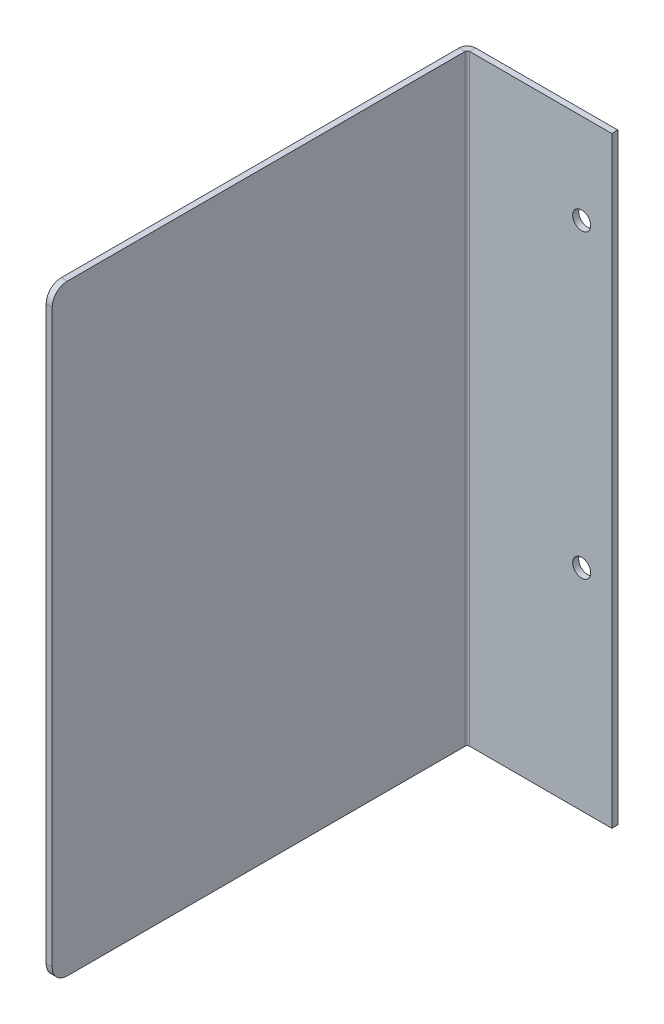
ISO-10303-21;
HEADER;
FILE_DESCRIPTION(('STEP AP214'),'2;1');
FILE_NAME('part.step','',(''),(''),'','','');
FILE_SCHEMA(('AUTOMOTIVE_DESIGN { 1 0 10303 214 1 1 1 1 }'));
ENDSEC;
DATA;
#1=APPLICATION_CONTEXT('core data for automotive mechanical design processes');
#2=APPLICATION_PROTOCOL_DEFINITION('international standard','automotive_design',2000,#1);
#3=PRODUCT_CONTEXT('',#1,'mechanical');
#4=PRODUCT('Part','Part','',(#3));
#5=PRODUCT_RELATED_PRODUCT_CATEGORY('part','',(#4));
#6=PRODUCT_DEFINITION_FORMATION('','',#4);
#7=PRODUCT_DEFINITION_CONTEXT('part definition',#1,'design');
#8=PRODUCT_DEFINITION('design','',#6,#7);
#9=PRODUCT_DEFINITION_SHAPE('','',#8);
#10=(LENGTH_UNIT() NAMED_UNIT(*) SI_UNIT(.MILLI.,.METRE.));
#11=(NAMED_UNIT(*) PLANE_ANGLE_UNIT() SI_UNIT($,.RADIAN.));
#12=(NAMED_UNIT(*) SI_UNIT($,.STERADIAN.) SOLID_ANGLE_UNIT());
#13=UNCERTAINTY_MEASURE_WITH_UNIT(LENGTH_MEASURE(1.E-05),#10,'distance_accuracy_value','');
#14=(GEOMETRIC_REPRESENTATION_CONTEXT(3) GLOBAL_UNCERTAINTY_ASSIGNED_CONTEXT((#13)) GLOBAL_UNIT_ASSIGNED_CONTEXT((#10,
#11,#12)) REPRESENTATION_CONTEXT('',''));
#15=CARTESIAN_POINT('',(0.,0.,0.));
#16=DIRECTION('',(0.,0.,1.));
#17=DIRECTION('',(1.,0.,0.));
#18=AXIS2_PLACEMENT_3D('',#15,#16,#17);
#19=CARTESIAN_POINT('',(-8.33759590792837,-192.250639386189,-2.));
#20=DIRECTION('',(0.,-1.,0.));
#21=DIRECTION('',(0.,0.,-1.));
#22=AXIS2_PLACEMENT_3D('',#19,#20,#21);
#23=PLANE('',#22);
#24=DIRECTION('',(1.,0.,0.));
#25=VECTOR('',#24,1.);
#26=CARTESIAN_POINT('',(-8.33759590792837,-192.250639386189,0.));
#27=LINE('',#26,#25);
#28=CARTESIAN_POINT('',(-5.60099590792837,-192.250639386189,0.));
#29=VERTEX_POINT('',#28);
#30=CARTESIAN_POINT('',(41.6624040920716,-192.250639386189,0.));
#31=VERTEX_POINT('',#30);
#32=EDGE_CURVE('E194',#29,#31,#27,.T.);
#33=ORIENTED_EDGE('',*,*,#32,.F.);
#34=DIRECTION('',(0.,0.,-1.));
#35=VECTOR('',#34,1.);
#36=CARTESIAN_POINT('',(-5.60099590792837,-192.250639386189,0.));
#37=LINE('',#36,#35);
#38=CARTESIAN_POINT('',(-5.60099590792834,-192.250639386189,-2.00000000000001));
#39=VERTEX_POINT('',#38);
#40=EDGE_CURVE('E183',#29,#39,#37,.T.);
#41=ORIENTED_EDGE('',*,*,#40,.T.);
#42=DIRECTION('',(1.,0.,0.));
#43=VECTOR('',#42,1.);
#44=CARTESIAN_POINT('',(-8.33759590792837,-192.250639386189,-2.));
#45=LINE('',#44,#43);
#46=CARTESIAN_POINT('',(41.6624040920716,-192.250639386189,-2.));
#47=VERTEX_POINT('',#46);
#48=EDGE_CURVE('E197',#39,#47,#45,.T.);
#49=ORIENTED_EDGE('',*,*,#48,.T.);
#50=DIRECTION('',(0.,0.,1.));
#51=VECTOR('',#50,1.);
#52=CARTESIAN_POINT('',(41.6624040920716,-192.250639386189,-2.));
#53=LINE('',#52,#51);
#54=EDGE_CURVE('E206',#47,#31,#53,.T.);
#55=ORIENTED_EDGE('',*,*,#54,.T.);
#56=EDGE_LOOP('',(#33,#41,#49,#55));
#57=FACE_BOUND('',#56,.T.);
#58=ADVANCED_FACE('F59',(#57),#23,.T.);
#59=CARTESIAN_POINT('',(0.,0.,-2.));
#60=DIRECTION('',(0.,0.,1.));
#61=DIRECTION('',(1.,0.,0.));
#62=AXIS2_PLACEMENT_3D('',#59,#60,#61);
#63=PLANE('',#62);
#64=CARTESIAN_POINT('',(31.6624040920716,-122.250639386189,-2.));
#65=DIRECTION('',(0.,0.,1.));
#66=DIRECTION('',(1.,0.,0.));
#67=AXIS2_PLACEMENT_3D('',#64,#65,#66);
#68=CIRCLE('',#67,3.);
#69=CARTESIAN_POINT('',(34.6624040920716,-122.250639386189,-2.));
#70=VERTEX_POINT('',#69);
#71=EDGE_CURVE('E253',#70,#70,#68,.T.);
#72=ORIENTED_EDGE('',*,*,#71,.T.);
#73=EDGE_LOOP('',(#72));
#74=FACE_BOUND('',#73,.T.);
#75=CARTESIAN_POINT('',(31.6624040920716,-22.2506393861893,-2.));
#76=DIRECTION('',(0.,0.,1.));
#77=DIRECTION('',(1.,0.,0.));
#78=AXIS2_PLACEMENT_3D('',#75,#76,#77);
#79=CIRCLE('',#78,3.);
#80=CARTESIAN_POINT('',(34.6624040920716,-22.2506393861893,-2.));
#81=VERTEX_POINT('',#80);
#82=EDGE_CURVE('E180',#81,#81,#79,.T.);
#83=ORIENTED_EDGE('',*,*,#82,.T.);
#84=EDGE_LOOP('',(#83));
#85=FACE_BOUND('',#84,.T.);
#86=DIRECTION('',(0.,-1.,0.));
#87=VECTOR('',#86,1.);
#88=CARTESIAN_POINT('',(-5.60099590792834,-192.250639386189,-2.00000000000001));
#89=LINE('',#88,#87);
#90=CARTESIAN_POINT('',(-5.60099590792837,7.74936061381075,-2.));
#91=VERTEX_POINT('',#90);
#92=EDGE_CURVE('E144',#39,#91,#89,.F.);
#93=ORIENTED_EDGE('',*,*,#92,.T.);
#94=DIRECTION('',(-1.,0.,0.));
#95=VECTOR('',#94,1.);
#96=CARTESIAN_POINT('',(-8.33759590792839,7.74936061381074,-2.));
#97=LINE('',#96,#95);
#98=CARTESIAN_POINT('',(41.6624040920716,7.74936061381074,-2.));
#99=VERTEX_POINT('',#98);
#100=EDGE_CURVE('E203',#99,#91,#97,.T.);
#101=ORIENTED_EDGE('',*,*,#100,.F.);
#102=DIRECTION('',(0.,1.,0.));
#103=VECTOR('',#102,1.);
#104=CARTESIAN_POINT('',(41.6624040920716,7.74936061381074,-2.));
#105=LINE('',#104,#103);
#106=EDGE_CURVE('E199',#47,#99,#105,.T.);
#107=ORIENTED_EDGE('',*,*,#106,.F.);
#108=ORIENTED_EDGE('',*,*,#48,.F.);
#109=EDGE_LOOP('',(#93,#101,#107,#108));
#110=FACE_BOUND('',#109,.T.);
#111=ADVANCED_FACE('F267',(#74,#85,#110),#63,.F.);
#112=CARTESIAN_POINT('',(0.,0.,0.));
#113=DIRECTION('',(0.,0.,1.));
#114=DIRECTION('',(1.,0.,0.));
#115=AXIS2_PLACEMENT_3D('',#112,#113,#114);
#116=PLANE('',#115);
#117=CARTESIAN_POINT('',(31.6624040920716,-122.250639386189,0.));
#118=DIRECTION('',(0.,0.,1.));
#119=DIRECTION('',(1.,0.,0.));
#120=AXIS2_PLACEMENT_3D('',#117,#118,#119);
#121=CIRCLE('',#120,3.);
#122=CARTESIAN_POINT('',(34.6624040920716,-122.250639386189,0.));
#123=VERTEX_POINT('',#122);
#124=EDGE_CURVE('E256',#123,#123,#121,.T.);
#125=ORIENTED_EDGE('',*,*,#124,.F.);
#126=EDGE_LOOP('',(#125));
#127=FACE_BOUND('',#126,.T.);
#128=CARTESIAN_POINT('',(31.6624040920716,-22.2506393861893,0.));
#129=DIRECTION('',(0.,0.,1.));
#130=DIRECTION('',(1.,0.,0.));
#131=AXIS2_PLACEMENT_3D('',#128,#129,#130);
#132=CIRCLE('',#131,3.);
#133=CARTESIAN_POINT('',(34.6624040920716,-22.2506393861893,0.));
#134=VERTEX_POINT('',#133);
#135=EDGE_CURVE('E250',#134,#134,#132,.T.);
#136=ORIENTED_EDGE('',*,*,#135,.F.);
#137=EDGE_LOOP('',(#136));
#138=FACE_BOUND('',#137,.T.);
#139=DIRECTION('',(-1.,0.,0.));
#140=VECTOR('',#139,1.);
#141=CARTESIAN_POINT('',(-8.33759590792839,7.74936061381074,0.));
#142=LINE('',#141,#140);
#143=CARTESIAN_POINT('',(41.6624040920716,7.74936061381074,0.));
#144=VERTEX_POINT('',#143);
#145=CARTESIAN_POINT('',(-5.60099590792837,7.74936061381073,0.));
#146=VERTEX_POINT('',#145);
#147=EDGE_CURVE('E200',#144,#146,#142,.T.);
#148=ORIENTED_EDGE('',*,*,#147,.T.);
#149=DIRECTION('',(0.,-1.,0.));
#150=VECTOR('',#149,1.);
#151=CARTESIAN_POINT('',(-5.60099590792837,-192.250639386189,0.));
#152=LINE('',#151,#150);
#153=EDGE_CURVE('E187',#29,#146,#152,.F.);
#154=ORIENTED_EDGE('',*,*,#153,.F.);
#155=ORIENTED_EDGE('',*,*,#32,.T.);
#156=DIRECTION('',(0.,1.,0.));
#157=VECTOR('',#156,1.);
#158=CARTESIAN_POINT('',(41.6624040920716,7.74936061381074,0.));
#159=LINE('',#158,#157);
#160=EDGE_CURVE('E208',#31,#144,#159,.T.);
#161=ORIENTED_EDGE('',*,*,#160,.T.);
#162=EDGE_LOOP('',(#148,#154,#155,#161));
#163=FACE_BOUND('',#162,.T.);
#164=ADVANCED_FACE('F263',(#127,#138,#163),#116,.T.);
#165=CARTESIAN_POINT('',(-8.33759590792839,7.74936061381074,-2.));
#166=DIRECTION('',(0.,1.,0.));
#167=DIRECTION('',(0.,0.,1.));
#168=AXIS2_PLACEMENT_3D('',#165,#166,#167);
#169=PLANE('',#168);
#170=DIRECTION('',(0.,0.,-1.));
#171=VECTOR('',#170,1.);
#172=CARTESIAN_POINT('',(-5.60099590792837,7.74936061381073,0.));
#173=LINE('',#172,#171);
#174=EDGE_CURVE('E191',#146,#91,#173,.T.);
#175=ORIENTED_EDGE('',*,*,#174,.F.);
#176=ORIENTED_EDGE('',*,*,#147,.F.);
#177=DIRECTION('',(0.,0.,1.));
#178=VECTOR('',#177,1.);
#179=CARTESIAN_POINT('',(41.6624040920716,7.74936061381074,-2.));
#180=LINE('',#179,#178);
#181=EDGE_CURVE('E213',#99,#144,#180,.T.);
#182=ORIENTED_EDGE('',*,*,#181,.F.);
#183=ORIENTED_EDGE('',*,*,#100,.T.);
#184=EDGE_LOOP('',(#175,#176,#182,#183));
#185=FACE_BOUND('',#184,.T.);
#186=ADVANCED_FACE('F266',(#185),#169,.T.);
#187=CARTESIAN_POINT('',(41.6624040920716,7.74936061381074,-2.));
#188=DIRECTION('',(1.,0.,0.));
#189=DIRECTION('',(0.,1.,0.));
#190=AXIS2_PLACEMENT_3D('',#187,#188,#189);
#191=PLANE('',#190);
#192=ORIENTED_EDGE('',*,*,#160,.F.);
#193=ORIENTED_EDGE('',*,*,#54,.F.);
#194=ORIENTED_EDGE('',*,*,#106,.T.);
#195=ORIENTED_EDGE('',*,*,#181,.T.);
#196=EDGE_LOOP('',(#192,#193,#194,#195));
#197=FACE_BOUND('',#196,.T.);
#198=ADVANCED_FACE('F286',(#197),#191,.T.);
#199=CARTESIAN_POINT('',(-5.60099590792838,7.74936061381073,0.736600000000001));
#200=DIRECTION('',(0.,1.,0.));
#201=DIRECTION('',(0.,0.,1.));
#202=AXIS2_PLACEMENT_3D('',#199,#200,#201);
#203=PLANE('',#202);
#204=DIRECTION('',(1.,0.,0.));
#205=VECTOR('',#204,1.);
#206=CARTESIAN_POINT('',(-8.33759590792839,7.74936061381074,0.736599999999989));
#207=LINE('',#206,#205);
#208=CARTESIAN_POINT('',(-6.33759590792839,7.74936061381073,0.736599999999999));
#209=VERTEX_POINT('',#208);
#210=CARTESIAN_POINT('',(-8.33759590792839,7.74936061381073,0.736599999999992));
#211=VERTEX_POINT('',#210);
#212=EDGE_CURVE('E177',#209,#211,#207,.F.);
#213=ORIENTED_EDGE('',*,*,#212,.F.);
#214=CARTESIAN_POINT('',(-5.60099590792838,7.74936061381073,0.736600000000001));
#215=DIRECTION('',(0.,-1.,0.));
#216=DIRECTION('',(0.,0.,-1.));
#217=AXIS2_PLACEMENT_3D('',#214,#215,#216);
#218=CIRCLE('',#217,0.736600000000013);
#219=EDGE_CURVE('E147',#146,#209,#218,.F.);
#220=ORIENTED_EDGE('',*,*,#219,.F.);
#221=ORIENTED_EDGE('',*,*,#174,.T.);
#222=CARTESIAN_POINT('',(-5.60099590792838,7.74936061381073,0.736600000000001));
#223=DIRECTION('',(0.,-1.,0.));
#224=DIRECTION('',(0.,0.,-1.));
#225=AXIS2_PLACEMENT_3D('',#222,#223,#224);
#226=CIRCLE('',#225,2.73660000000001);
#227=EDGE_CURVE('E182',#91,#211,#226,.F.);
#228=ORIENTED_EDGE('',*,*,#227,.T.);
#229=EDGE_LOOP('',(#213,#220,#221,#228));
#230=FACE_BOUND('',#229,.T.);
#231=ADVANCED_FACE('F279',(#230),#203,.T.);
#232=CARTESIAN_POINT('',(-5.60099590792838,-192.250639386189,0.736600000000001));
#233=DIRECTION('',(0.,1.,0.));
#234=DIRECTION('',(0.,0.,1.));
#235=AXIS2_PLACEMENT_3D('',#232,#233,#234);
#236=PLANE('',#235);
#237=CARTESIAN_POINT('',(-5.60099590792838,-192.250639386189,0.736600000000001));
#238=DIRECTION('',(0.,-1.,0.));
#239=DIRECTION('',(0.,0.,-1.));
#240=AXIS2_PLACEMENT_3D('',#237,#238,#239);
#241=CIRCLE('',#240,0.736600000000013);
#242=CARTESIAN_POINT('',(-6.33759590792839,-192.250639386189,0.736599999999999));
#243=VERTEX_POINT('',#242);
#244=EDGE_CURVE('E154',#243,#29,#241,.T.);
#245=ORIENTED_EDGE('',*,*,#244,.F.);
#246=DIRECTION('',(1.,0.,0.));
#247=VECTOR('',#246,1.);
#248=CARTESIAN_POINT('',(-6.33759590792837,-192.250639386189,0.736600000000001));
#249=LINE('',#248,#247);
#250=CARTESIAN_POINT('',(-8.33759590792837,-192.250639386189,0.736599999999994));
#251=VERTEX_POINT('',#250);
#252=EDGE_CURVE('E151',#243,#251,#249,.F.);
#253=ORIENTED_EDGE('',*,*,#252,.T.);
#254=CARTESIAN_POINT('',(-5.60099590792838,-192.250639386189,0.736600000000001));
#255=DIRECTION('',(0.,-1.,0.));
#256=DIRECTION('',(0.,0.,-1.));
#257=AXIS2_PLACEMENT_3D('',#254,#255,#256);
#258=CIRCLE('',#257,2.73660000000001);
#259=EDGE_CURVE('E137',#251,#39,#258,.T.);
#260=ORIENTED_EDGE('',*,*,#259,.T.);
#261=ORIENTED_EDGE('',*,*,#40,.F.);
#262=EDGE_LOOP('',(#245,#253,#260,#261));
#263=FACE_BOUND('',#262,.T.);
#264=ADVANCED_FACE('F152',(#263),#236,.F.);
#265=CARTESIAN_POINT('',(-5.60099590792838,-192.250639386189,0.736600000000001));
#266=DIRECTION('',(0.,-1.,0.));
#267=DIRECTION('',(-1.,0.,0.));
#268=AXIS2_PLACEMENT_3D('',#265,#266,#267);
#269=CYLINDRICAL_SURFACE('',#268,2.73660000000001);
#270=ORIENTED_EDGE('',*,*,#92,.F.);
#271=ORIENTED_EDGE('',*,*,#259,.F.);
#272=DIRECTION('',(0.,-1.,0.));
#273=VECTOR('',#272,1.);
#274=CARTESIAN_POINT('',(-8.33759590792839,7.74936061381074,0.736599999999989));
#275=LINE('',#274,#273);
#276=EDGE_CURVE('E142',#251,#211,#275,.F.);
#277=ORIENTED_EDGE('',*,*,#276,.T.);
#278=ORIENTED_EDGE('',*,*,#227,.F.);
#279=EDGE_LOOP('',(#270,#271,#277,#278));
#280=FACE_BOUND('',#279,.T.);
#281=ADVANCED_FACE('F139',(#280),#269,.T.);
#282=CARTESIAN_POINT('',(-5.60099590792838,-192.250639386189,0.736600000000001));
#283=DIRECTION('',(0.,-1.,0.));
#284=DIRECTION('',(-1.,0.,0.));
#285=AXIS2_PLACEMENT_3D('',#282,#283,#284);
#286=CYLINDRICAL_SURFACE('',#285,0.736600000000013);
#287=ORIENTED_EDGE('',*,*,#153,.T.);
#288=ORIENTED_EDGE('',*,*,#219,.T.);
#289=DIRECTION('',(0.,-1.,0.));
#290=VECTOR('',#289,1.);
#291=CARTESIAN_POINT('',(-6.33759590792839,7.74936061381074,0.736599999999996));
#292=LINE('',#291,#290);
#293=EDGE_CURVE('E155',#209,#243,#292,.T.);
#294=ORIENTED_EDGE('',*,*,#293,.T.);
#295=ORIENTED_EDGE('',*,*,#244,.T.);
#296=EDGE_LOOP('',(#287,#288,#294,#295));
#297=FACE_BOUND('',#296,.T.);
#298=ADVANCED_FACE('F277',(#297),#286,.F.);
#299=CARTESIAN_POINT('',(-8.33759590792885,-192.250639386189,138.));
#300=DIRECTION('',(0.,1.,0.));
#301=DIRECTION('',(0.,0.,1.));
#302=AXIS2_PLACEMENT_3D('',#299,#300,#301);
#303=PLANE('',#302);
#304=DIRECTION('',(0.,0.,-1.));
#305=VECTOR('',#304,1.);
#306=CARTESIAN_POINT('',(-6.33759590792885,-192.250639386189,138.));
#307=LINE('',#306,#305);
#308=CARTESIAN_POINT('',(-6.33759590792883,-192.250639386189,133.));
#309=VERTEX_POINT('',#308);
#310=EDGE_CURVE('E163',#243,#309,#307,.F.);
#311=ORIENTED_EDGE('',*,*,#310,.T.);
#312=DIRECTION('',(1.,0.,0.));
#313=VECTOR('',#312,1.);
#314=CARTESIAN_POINT('',(-8.33759590792883,-192.250639386189,133.));
#315=LINE('',#314,#313);
#316=CARTESIAN_POINT('',(-8.33759590792883,-192.250639386189,133.));
#317=VERTEX_POINT('',#316);
#318=EDGE_CURVE('E67',#309,#317,#315,.F.);
#319=ORIENTED_EDGE('',*,*,#318,.T.);
#320=DIRECTION('',(0.,0.,1.));
#321=VECTOR('',#320,1.);
#322=CARTESIAN_POINT('',(-8.33759590792837,-192.250639386189,0.));
#323=LINE('',#322,#321);
#324=EDGE_CURVE('E159',#251,#317,#323,.T.);
#325=ORIENTED_EDGE('',*,*,#324,.F.);
#326=ORIENTED_EDGE('',*,*,#252,.F.);
#327=EDGE_LOOP('',(#311,#319,#325,#326));
#328=FACE_BOUND('',#327,.T.);
#329=ADVANCED_FACE('F165',(#328),#303,.F.);
#330=CARTESIAN_POINT('',(-8.33759590792839,7.74936061381074,0.));
#331=DIRECTION('',(0.,-1.,0.));
#332=DIRECTION('',(1.,0.,0.));
#333=AXIS2_PLACEMENT_3D('',#330,#331,#332);
#334=PLANE('',#333);
#335=DIRECTION('',(0.,0.,-1.));
#336=VECTOR('',#335,1.);
#337=CARTESIAN_POINT('',(-8.33759590792839,7.74936061381074,0.));
#338=LINE('',#337,#336);
#339=CARTESIAN_POINT('',(-8.33759590792886,7.74936061381074,133.));
#340=VERTEX_POINT('',#339);
#341=EDGE_CURVE('E162',#340,#211,#338,.T.);
#342=ORIENTED_EDGE('',*,*,#341,.F.);
#343=DIRECTION('',(1.,0.,0.));
#344=VECTOR('',#343,1.);
#345=CARTESIAN_POINT('',(-8.33759590792886,7.74936061381074,133.));
#346=LINE('',#345,#344);
#347=CARTESIAN_POINT('',(-6.33759590792885,7.74936061381074,133.));
#348=VERTEX_POINT('',#347);
#349=EDGE_CURVE('E215',#340,#348,#346,.T.);
#350=ORIENTED_EDGE('',*,*,#349,.T.);
#351=DIRECTION('',(0.,0.,1.));
#352=VECTOR('',#351,1.);
#353=CARTESIAN_POINT('',(-6.33759590792839,7.74936061381074,0.));
#354=LINE('',#353,#352);
#355=EDGE_CURVE('E167',#348,#209,#354,.F.);
#356=ORIENTED_EDGE('',*,*,#355,.T.);
#357=ORIENTED_EDGE('',*,*,#212,.T.);
#358=EDGE_LOOP('',(#342,#350,#356,#357));
#359=FACE_BOUND('',#358,.T.);
#360=ADVANCED_FACE('F245',(#359),#334,.F.);
#361=CARTESIAN_POINT('',(-8.33759590792839,0.,0.));
#362=DIRECTION('',(1.,0.,0.));
#363=DIRECTION('',(0.,0.,-1.));
#364=AXIS2_PLACEMENT_3D('',#361,#362,#363);
#365=PLANE('',#364);
#366=ORIENTED_EDGE('',*,*,#324,.T.);
#367=CARTESIAN_POINT('',(-8.33759590792883,-187.250639386189,133.));
#368=DIRECTION('',(1.,0.,0.));
#369=DIRECTION('',(0.,0.,-1.));
#370=AXIS2_PLACEMENT_3D('',#367,#368,#369);
#371=CIRCLE('',#370,5.);
#372=CARTESIAN_POINT('',(-8.33759590792885,-187.250639386189,138.));
#373=VERTEX_POINT('',#372);
#374=EDGE_CURVE('E13',#317,#373,#371,.F.);
#375=ORIENTED_EDGE('',*,*,#374,.T.);
#376=DIRECTION('',(0.,1.,0.));
#377=VECTOR('',#376,1.);
#378=CARTESIAN_POINT('',(-8.33759590792887,0.,138.));
#379=LINE('',#378,#377);
#380=CARTESIAN_POINT('',(-8.33759590792887,2.74936061381074,138.));
#381=VERTEX_POINT('',#380);
#382=EDGE_CURVE('E166',#373,#381,#379,.T.);
#383=ORIENTED_EDGE('',*,*,#382,.T.);
#384=CARTESIAN_POINT('',(-8.33759590792885,2.74936061381074,133.));
#385=DIRECTION('',(1.,0.,0.));
#386=DIRECTION('',(0.,0.,-1.));
#387=AXIS2_PLACEMENT_3D('',#384,#385,#386);
#388=CIRCLE('',#387,5.);
#389=EDGE_CURVE('E226',#381,#340,#388,.F.);
#390=ORIENTED_EDGE('',*,*,#389,.T.);
#391=ORIENTED_EDGE('',*,*,#341,.T.);
#392=ORIENTED_EDGE('',*,*,#276,.F.);
#393=EDGE_LOOP('',(#366,#375,#383,#390,#391,#392));
#394=FACE_BOUND('',#393,.T.);
#395=ADVANCED_FACE('F158',(#394),#365,.F.);
#396=CARTESIAN_POINT('',(-6.33759590792839,0.,0.));
#397=DIRECTION('',(1.,0.,0.));
#398=DIRECTION('',(0.,0.,-1.));
#399=AXIS2_PLACEMENT_3D('',#396,#397,#398);
#400=PLANE('',#399);
#401=DIRECTION('',(0.,-1.,0.));
#402=VECTOR('',#401,1.);
#403=CARTESIAN_POINT('',(-6.33759590792887,7.74936061381074,138.));
#404=LINE('',#403,#402);
#405=CARTESIAN_POINT('',(-6.33759590792885,-187.250639386189,138.));
#406=VERTEX_POINT('',#405);
#407=CARTESIAN_POINT('',(-6.33759590792887,2.74936061381074,138.));
#408=VERTEX_POINT('',#407);
#409=EDGE_CURVE('E170',#406,#408,#404,.F.);
#410=ORIENTED_EDGE('',*,*,#409,.F.);
#411=CARTESIAN_POINT('',(-6.33759590792883,-187.250639386189,133.));
#412=DIRECTION('',(1.,0.,0.));
#413=DIRECTION('',(0.,0.,-1.));
#414=AXIS2_PLACEMENT_3D('',#411,#412,#413);
#415=CIRCLE('',#414,5.);
#416=EDGE_CURVE('E81',#406,#309,#415,.T.);
#417=ORIENTED_EDGE('',*,*,#416,.T.);
#418=ORIENTED_EDGE('',*,*,#310,.F.);
#419=ORIENTED_EDGE('',*,*,#293,.F.);
#420=ORIENTED_EDGE('',*,*,#355,.F.);
#421=CARTESIAN_POINT('',(-6.33759590792885,2.74936061381074,133.));
#422=DIRECTION('',(1.,0.,0.));
#423=DIRECTION('',(0.,0.,-1.));
#424=AXIS2_PLACEMENT_3D('',#421,#422,#423);
#425=CIRCLE('',#424,5.);
#426=EDGE_CURVE('E220',#348,#408,#425,.T.);
#427=ORIENTED_EDGE('',*,*,#426,.T.);
#428=EDGE_LOOP('',(#410,#417,#418,#419,#420,#427));
#429=FACE_BOUND('',#428,.T.);
#430=ADVANCED_FACE('F236',(#429),#400,.T.);
#431=CARTESIAN_POINT('',(-8.33759590792887,7.74936061381074,138.));
#432=DIRECTION('',(0.,0.,-1.));
#433=DIRECTION('',(-1.,0.,0.));
#434=AXIS2_PLACEMENT_3D('',#431,#432,#433);
#435=PLANE('',#434);
#436=ORIENTED_EDGE('',*,*,#382,.F.);
#437=DIRECTION('',(1.,0.,0.));
#438=VECTOR('',#437,1.);
#439=CARTESIAN_POINT('',(-8.33759590792885,-187.250639386189,138.));
#440=LINE('',#439,#438);
#441=EDGE_CURVE('E228',#373,#406,#440,.T.);
#442=ORIENTED_EDGE('',*,*,#441,.T.);
#443=ORIENTED_EDGE('',*,*,#409,.T.);
#444=DIRECTION('',(1.,0.,0.));
#445=VECTOR('',#444,1.);
#446=CARTESIAN_POINT('',(-8.33759590792887,2.74936061381074,138.));
#447=LINE('',#446,#445);
#448=EDGE_CURVE('E223',#408,#381,#447,.F.);
#449=ORIENTED_EDGE('',*,*,#448,.T.);
#450=EDGE_LOOP('',(#436,#442,#443,#449));
#451=FACE_BOUND('',#450,.T.);
#452=ADVANCED_FACE('F234',(#451),#435,.F.);
#453=CARTESIAN_POINT('',(31.6624040920716,-22.2506393861893,-10.));
#454=DIRECTION('',(0.,0.,1.));
#455=DIRECTION('',(1.,0.,0.));
#456=AXIS2_PLACEMENT_3D('',#453,#454,#455);
#457=CYLINDRICAL_SURFACE('',#456,3.);
#458=ORIENTED_EDGE('',*,*,#135,.T.);
#459=EDGE_LOOP('',(#458));
#460=FACE_BOUND('',#459,.T.);
#461=ORIENTED_EDGE('',*,*,#82,.F.);
#462=EDGE_LOOP('',(#461));
#463=FACE_BOUND('',#462,.T.);
#464=ADVANCED_FACE('F307',(#460,#463),#457,.F.);
#465=CARTESIAN_POINT('',(31.6624040920716,-122.250639386189,-10.));
#466=DIRECTION('',(0.,0.,1.));
#467=DIRECTION('',(1.,0.,0.));
#468=AXIS2_PLACEMENT_3D('',#465,#466,#467);
#469=CYLINDRICAL_SURFACE('',#468,3.);
#470=ORIENTED_EDGE('',*,*,#124,.T.);
#471=EDGE_LOOP('',(#470));
#472=FACE_BOUND('',#471,.T.);
#473=ORIENTED_EDGE('',*,*,#71,.F.);
#474=EDGE_LOOP('',(#473));
#475=FACE_BOUND('',#474,.T.);
#476=ADVANCED_FACE('F260',(#472,#475),#469,.F.);
#477=CARTESIAN_POINT('',(-8.33759590792886,2.74936061381074,133.));
#478=DIRECTION('',(1.,0.,0.));
#479=DIRECTION('',(0.,0.,-1.));
#480=AXIS2_PLACEMENT_3D('',#477,#478,#479);
#481=CYLINDRICAL_SURFACE('',#480,5.);
#482=ORIENTED_EDGE('',*,*,#389,.F.);
#483=ORIENTED_EDGE('',*,*,#448,.F.);
#484=ORIENTED_EDGE('',*,*,#426,.F.);
#485=ORIENTED_EDGE('',*,*,#349,.F.);
#486=EDGE_LOOP('',(#482,#483,#484,#485));
#487=FACE_BOUND('',#486,.T.);
#488=ADVANCED_FACE('F243',(#487),#481,.T.);
#489=CARTESIAN_POINT('',(-8.33759590792883,-187.250639386189,133.));
#490=DIRECTION('',(1.,0.,0.));
#491=DIRECTION('',(0.,0.,-1.));
#492=AXIS2_PLACEMENT_3D('',#489,#490,#491);
#493=CYLINDRICAL_SURFACE('',#492,5.);
#494=ORIENTED_EDGE('',*,*,#374,.F.);
#495=ORIENTED_EDGE('',*,*,#318,.F.);
#496=ORIENTED_EDGE('',*,*,#416,.F.);
#497=ORIENTED_EDGE('',*,*,#441,.F.);
#498=EDGE_LOOP('',(#494,#495,#496,#497));
#499=FACE_BOUND('',#498,.T.);
#500=ADVANCED_FACE('F61',(#499),#493,.T.);
#501=CLOSED_SHELL('',(#58,#111,#164,#186,#198,#231,#264,#281,#298,#329,#360,#395,#430,#452,#464,
#476,#488,#500));
#502=MANIFOLD_SOLID_BREP('B2',#501);
#503=ADVANCED_BREP_SHAPE_REPRESENTATION('',(#18,#502),#14);
#504=SHAPE_DEFINITION_REPRESENTATION(#9,#503);
ENDSEC;
END-ISO-10303-21;
